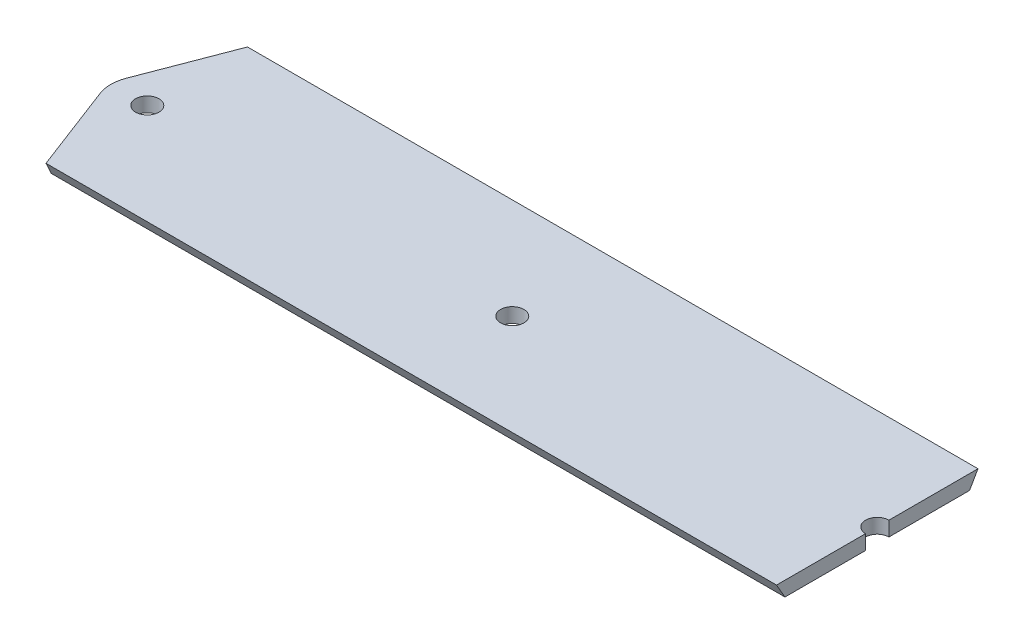
ISO-10303-21;
HEADER;
FILE_DESCRIPTION(('STEP AP214'),'2;1');
FILE_NAME('part.step','',(''),(''),'','','');
FILE_SCHEMA(('AUTOMOTIVE_DESIGN { 1 0 10303 214 1 1 1 1 }'));
ENDSEC;
DATA;
#1=APPLICATION_CONTEXT('core data for automotive mechanical design processes');
#2=APPLICATION_PROTOCOL_DEFINITION('international standard','automotive_design',2000,#1);
#3=PRODUCT_CONTEXT('',#1,'mechanical');
#4=PRODUCT('Part','Part','',(#3));
#5=PRODUCT_RELATED_PRODUCT_CATEGORY('part','',(#4));
#6=PRODUCT_DEFINITION_FORMATION('','',#4);
#7=PRODUCT_DEFINITION_CONTEXT('part definition',#1,'design');
#8=PRODUCT_DEFINITION('design','',#6,#7);
#9=PRODUCT_DEFINITION_SHAPE('','',#8);
#10=(LENGTH_UNIT() NAMED_UNIT(*) SI_UNIT(.MILLI.,.METRE.));
#11=(NAMED_UNIT(*) PLANE_ANGLE_UNIT() SI_UNIT($,.RADIAN.));
#12=(NAMED_UNIT(*) SI_UNIT($,.STERADIAN.) SOLID_ANGLE_UNIT());
#13=UNCERTAINTY_MEASURE_WITH_UNIT(LENGTH_MEASURE(1.E-05),#10,'distance_accuracy_value','');
#14=(GEOMETRIC_REPRESENTATION_CONTEXT(3) GLOBAL_UNCERTAINTY_ASSIGNED_CONTEXT((#13)) GLOBAL_UNIT_ASSIGNED_CONTEXT((#10,
#11,#12)) REPRESENTATION_CONTEXT('',''));
#15=CARTESIAN_POINT('',(0.,0.,0.));
#16=DIRECTION('',(0.,0.,1.));
#17=DIRECTION('',(1.,0.,0.));
#18=AXIS2_PLACEMENT_3D('',#15,#16,#17);
#19=CARTESIAN_POINT('',(50.,2.,0.));
#20=DIRECTION('',(-1.,0.,0.));
#21=DIRECTION('',(0.,0.,1.));
#22=AXIS2_PLACEMENT_3D('',#19,#20,#21);
#23=PLANE('',#22);
#24=DIRECTION('',(0.,0.,-1.));
#25=VECTOR('',#24,1.);
#26=CARTESIAN_POINT('',(50.,2.,0.));
#27=LINE('',#26,#25);
#28=CARTESIAN_POINT('',(50.,2.,13.8));
#29=VERTEX_POINT('',#28);
#30=CARTESIAN_POINT('',(50.,2.,1.6));
#31=VERTEX_POINT('',#30);
#32=EDGE_CURVE('E119',#29,#31,#27,.T.);
#33=ORIENTED_EDGE('',*,*,#32,.F.);
#34=DIRECTION('',(0.,-0.866025403784436,-0.500000000000004));
#35=VECTOR('',#34,1.);
#36=CARTESIAN_POINT('',(50.,0.,12.6452994616207));
#37=LINE('',#36,#35);
#38=CARTESIAN_POINT('',(50.,0.,12.6452994616207));
#39=VERTEX_POINT('',#38);
#40=EDGE_CURVE('E105',#29,#39,#37,.T.);
#41=ORIENTED_EDGE('',*,*,#40,.T.);
#42=DIRECTION('',(0.,0.,-1.));
#43=VECTOR('',#42,1.);
#44=CARTESIAN_POINT('',(50.,0.,0.));
#45=LINE('',#44,#43);
#46=CARTESIAN_POINT('',(50.,0.,1.6));
#47=VERTEX_POINT('',#46);
#48=EDGE_CURVE('E160',#39,#47,#45,.T.);
#49=ORIENTED_EDGE('',*,*,#48,.T.);
#50=DIRECTION('',(0.,-1.,0.));
#51=VECTOR('',#50,1.);
#52=CARTESIAN_POINT('',(50.,2.,1.6));
#53=LINE('',#52,#51);
#54=EDGE_CURVE('E11',#31,#47,#53,.T.);
#55=ORIENTED_EDGE('',*,*,#54,.F.);
#56=EDGE_LOOP('',(#33,#41,#49,#55));
#57=FACE_BOUND('',#56,.T.);
#58=ADVANCED_FACE('F41',(#57),#23,.F.);
#59=CARTESIAN_POINT('',(50.,2.,0.));
#60=DIRECTION('',(0.,-1.,0.));
#61=DIRECTION('',(0.,0.,-1.));
#62=AXIS2_PLACEMENT_3D('',#59,#60,#61);
#63=CYLINDRICAL_SURFACE('',#62,1.6);
#64=CARTESIAN_POINT('',(50.,0.,0.));
#65=DIRECTION('',(0.,1.,0.));
#66=DIRECTION('',(0.,0.,1.));
#67=AXIS2_PLACEMENT_3D('',#64,#65,#66);
#68=CIRCLE('',#67,1.6);
#69=CARTESIAN_POINT('',(50.,0.,-1.6));
#70=VERTEX_POINT('',#69);
#71=EDGE_CURVE('E163',#47,#70,#68,.F.);
#72=ORIENTED_EDGE('',*,*,#71,.T.);
#73=DIRECTION('',(0.,-1.,0.));
#74=VECTOR('',#73,1.);
#75=CARTESIAN_POINT('',(50.,2.,-1.6));
#76=LINE('',#75,#74);
#77=CARTESIAN_POINT('',(50.,2.,-1.6));
#78=VERTEX_POINT('',#77);
#79=EDGE_CURVE('E50',#78,#70,#76,.T.);
#80=ORIENTED_EDGE('',*,*,#79,.F.);
#81=CARTESIAN_POINT('',(50.,2.,0.));
#82=DIRECTION('',(0.,1.,0.));
#83=DIRECTION('',(0.,0.,1.));
#84=AXIS2_PLACEMENT_3D('',#81,#82,#83);
#85=CIRCLE('',#84,1.6);
#86=EDGE_CURVE('E127',#31,#78,#85,.F.);
#87=ORIENTED_EDGE('',*,*,#86,.F.);
#88=ORIENTED_EDGE('',*,*,#54,.T.);
#89=EDGE_LOOP('',(#72,#80,#87,#88));
#90=FACE_BOUND('',#89,.T.);
#91=ADVANCED_FACE('F237',(#90),#63,.F.);
#92=CARTESIAN_POINT('',(50.,2.,0.));
#93=DIRECTION('',(-1.,0.,0.));
#94=DIRECTION('',(0.,0.,1.));
#95=AXIS2_PLACEMENT_3D('',#92,#93,#94);
#96=PLANE('',#95);
#97=DIRECTION('',(0.,0.,-1.));
#98=VECTOR('',#97,1.);
#99=CARTESIAN_POINT('',(50.,0.,0.));
#100=LINE('',#99,#98);
#101=CARTESIAN_POINT('',(50.,0.,-12.6452994616207));
#102=VERTEX_POINT('',#101);
#103=EDGE_CURVE('E166',#70,#102,#100,.T.);
#104=ORIENTED_EDGE('',*,*,#103,.T.);
#105=DIRECTION('',(0.,0.866025403784436,-0.500000000000004));
#106=VECTOR('',#105,1.);
#107=CARTESIAN_POINT('',(50.,0.,-12.6452994616207));
#108=LINE('',#107,#106);
#109=CARTESIAN_POINT('',(50.,2.,-13.8));
#110=VERTEX_POINT('',#109);
#111=EDGE_CURVE('E65',#102,#110,#108,.T.);
#112=ORIENTED_EDGE('',*,*,#111,.T.);
#113=DIRECTION('',(0.,0.,-1.));
#114=VECTOR('',#113,1.);
#115=CARTESIAN_POINT('',(50.,2.,0.));
#116=LINE('',#115,#114);
#117=EDGE_CURVE('E132',#78,#110,#116,.T.);
#118=ORIENTED_EDGE('',*,*,#117,.F.);
#119=ORIENTED_EDGE('',*,*,#79,.T.);
#120=EDGE_LOOP('',(#104,#112,#118,#119));
#121=FACE_BOUND('',#120,.T.);
#122=ADVANCED_FACE('F192',(#121),#96,.F.);
#123=CARTESIAN_POINT('',(-48.2926978476711,2.,-18.4651745288546));
#124=DIRECTION('',(0.934049773615859,0.,0.357142857142856));
#125=DIRECTION('',(0.357142857142857,0.,-0.934049773615859));
#126=AXIS2_PLACEMENT_3D('',#123,#124,#125);
#127=PLANE('',#126);
#128=DIRECTION('',(-0.357142857142857,0.,0.934049773615859));
#129=VECTOR('',#128,1.);
#130=CARTESIAN_POINT('',(-48.2926978476711,2.,-18.4651745288546));
#131=LINE('',#130,#129);
#132=CARTESIAN_POINT('',(-50.0764719112902,2.,-13.8));
#133=VERTEX_POINT('',#132);
#134=CARTESIAN_POINT('',(-54.6702488680793,2.,-1.78571428571427));
#135=VERTEX_POINT('',#134);
#136=EDGE_CURVE('E142',#133,#135,#131,.T.);
#137=ORIENTED_EDGE('',*,*,#136,.F.);
#138=DIRECTION('',(-0.187778941547171,-0.850619951466907,0.491105657957491));
#139=VECTOR('',#138,1.);
#140=CARTESIAN_POINT('',(-49.5833552449018,4.23376951310278,-15.0896674296975));
#141=LINE('',#140,#139);
#142=CARTESIAN_POINT('',(-50.5179826969785,0.,-12.6452994616207));
#143=VERTEX_POINT('',#142);
#144=EDGE_CURVE('E156',#133,#143,#141,.T.);
#145=ORIENTED_EDGE('',*,*,#144,.T.);
#146=DIRECTION('',(-0.357142857142857,0.,0.934049773615859));
#147=VECTOR('',#146,1.);
#148=CARTESIAN_POINT('',(-48.2926978476711,0.,-18.4651745288546));
#149=LINE('',#148,#147);
#150=CARTESIAN_POINT('',(-54.6702488680793,0.,-1.78571428571427));
#151=VERTEX_POINT('',#150);
#152=EDGE_CURVE('E170',#143,#151,#149,.T.);
#153=ORIENTED_EDGE('',*,*,#152,.T.);
#154=DIRECTION('',(0.,-1.,0.));
#155=VECTOR('',#154,1.);
#156=CARTESIAN_POINT('',(-54.6702488680793,2.,-1.78571428571427));
#157=LINE('',#156,#155);
#158=EDGE_CURVE('E183',#135,#151,#157,.T.);
#159=ORIENTED_EDGE('',*,*,#158,.F.);
#160=EDGE_LOOP('',(#137,#145,#153,#159));
#161=FACE_BOUND('',#160,.T.);
#162=ADVANCED_FACE('F246',(#161),#127,.F.);
#163=CARTESIAN_POINT('',(-50.,2.,0.));
#164=DIRECTION('',(0.,-1.,0.));
#165=DIRECTION('',(0.,0.,-1.));
#166=AXIS2_PLACEMENT_3D('',#163,#164,#165);
#167=CYLINDRICAL_SURFACE('',#166,4.99999999999999);
#168=CARTESIAN_POINT('',(-50.,0.,0.));
#169=DIRECTION('',(0.,1.,0.));
#170=DIRECTION('',(0.,0.,1.));
#171=AXIS2_PLACEMENT_3D('',#168,#169,#170);
#172=CIRCLE('',#171,4.99999999999999);
#173=CARTESIAN_POINT('',(-54.6702488680793,0.,1.78571428571429));
#174=VERTEX_POINT('',#173);
#175=EDGE_CURVE('E173',#151,#174,#172,.T.);
#176=ORIENTED_EDGE('',*,*,#175,.T.);
#177=DIRECTION('',(0.,-1.,0.));
#178=VECTOR('',#177,1.);
#179=CARTESIAN_POINT('',(-54.6702488680793,2.,1.78571428571429));
#180=LINE('',#179,#178);
#181=CARTESIAN_POINT('',(-54.6702488680793,2.,1.78571428571429));
#182=VERTEX_POINT('',#181);
#183=EDGE_CURVE('E150',#182,#174,#180,.T.);
#184=ORIENTED_EDGE('',*,*,#183,.F.);
#185=CARTESIAN_POINT('',(-50.,2.,0.));
#186=DIRECTION('',(0.,1.,0.));
#187=DIRECTION('',(0.,0.,1.));
#188=AXIS2_PLACEMENT_3D('',#185,#186,#187);
#189=CIRCLE('',#188,4.99999999999999);
#190=EDGE_CURVE('E145',#135,#182,#189,.T.);
#191=ORIENTED_EDGE('',*,*,#190,.F.);
#192=ORIENTED_EDGE('',*,*,#158,.T.);
#193=EDGE_LOOP('',(#176,#184,#191,#192));
#194=FACE_BOUND('',#193,.T.);
#195=ADVANCED_FACE('F249',(#194),#167,.T.);
#196=CARTESIAN_POINT('',(-48.2926978476711,2.,18.4651745288546));
#197=DIRECTION('',(0.934049773615859,0.,-0.357142857142857));
#198=DIRECTION('',(-0.357142857142857,0.,-0.934049773615859));
#199=AXIS2_PLACEMENT_3D('',#196,#197,#198);
#200=PLANE('',#199);
#201=DIRECTION('',(0.357142857142857,0.,0.934049773615859));
#202=VECTOR('',#201,1.);
#203=CARTESIAN_POINT('',(-48.2926978476711,0.,18.4651745288546));
#204=LINE('',#203,#202);
#205=CARTESIAN_POINT('',(-50.5179826969785,0.,12.6452994616207));
#206=VERTEX_POINT('',#205);
#207=EDGE_CURVE('E176',#174,#206,#204,.T.);
#208=ORIENTED_EDGE('',*,*,#207,.T.);
#209=DIRECTION('',(0.187778941547171,0.850619951466907,0.491105657957491));
#210=VECTOR('',#209,1.);
#211=CARTESIAN_POINT('',(-49.5833552449018,4.23376951310278,15.0896674296975));
#212=LINE('',#211,#210);
#213=CARTESIAN_POINT('',(-50.0764719112902,2.,13.8));
#214=VERTEX_POINT('',#213);
#215=EDGE_CURVE('E57',#206,#214,#212,.T.);
#216=ORIENTED_EDGE('',*,*,#215,.T.);
#217=DIRECTION('',(0.357142857142857,0.,0.934049773615859));
#218=VECTOR('',#217,1.);
#219=CARTESIAN_POINT('',(-48.2926978476711,2.,18.4651745288546));
#220=LINE('',#219,#218);
#221=EDGE_CURVE('E122',#182,#214,#220,.T.);
#222=ORIENTED_EDGE('',*,*,#221,.F.);
#223=ORIENTED_EDGE('',*,*,#183,.T.);
#224=EDGE_LOOP('',(#208,#216,#222,#223));
#225=FACE_BOUND('',#224,.T.);
#226=ADVANCED_FACE('F224',(#225),#200,.F.);
#227=CARTESIAN_POINT('',(0.,2.,0.));
#228=DIRECTION('',(0.,-1.,0.));
#229=DIRECTION('',(0.,0.,-1.));
#230=AXIS2_PLACEMENT_3D('',#227,#228,#229);
#231=CYLINDRICAL_SURFACE('',#230,1.6);
#232=CARTESIAN_POINT('',(0.,2.,0.));
#233=DIRECTION('',(0.,1.,0.));
#234=DIRECTION('',(0.,0.,1.));
#235=AXIS2_PLACEMENT_3D('',#232,#233,#234);
#236=CIRCLE('',#235,1.6);
#237=CARTESIAN_POINT('',(0.,2.,1.6));
#238=VERTEX_POINT('',#237);
#239=EDGE_CURVE('E128',#238,#238,#236,.T.);
#240=ORIENTED_EDGE('',*,*,#239,.T.);
#241=EDGE_LOOP('',(#240));
#242=FACE_BOUND('',#241,.T.);
#243=CARTESIAN_POINT('',(0.,0.,0.));
#244=DIRECTION('',(0.,1.,0.));
#245=DIRECTION('',(0.,0.,1.));
#246=AXIS2_PLACEMENT_3D('',#243,#244,#245);
#247=CIRCLE('',#246,1.6);
#248=CARTESIAN_POINT('',(0.,0.,1.6));
#249=VERTEX_POINT('',#248);
#250=EDGE_CURVE('E155',#249,#249,#247,.T.);
#251=ORIENTED_EDGE('',*,*,#250,.F.);
#252=EDGE_LOOP('',(#251));
#253=FACE_BOUND('',#252,.T.);
#254=ADVANCED_FACE('F221',(#242,#253),#231,.F.);
#255=CARTESIAN_POINT('',(-50.,2.,0.));
#256=DIRECTION('',(0.,-1.,0.));
#257=DIRECTION('',(0.,0.,-1.));
#258=AXIS2_PLACEMENT_3D('',#255,#256,#257);
#259=CYLINDRICAL_SURFACE('',#258,1.6);
#260=CARTESIAN_POINT('',(-50.,2.,0.));
#261=DIRECTION('',(0.,1.,0.));
#262=DIRECTION('',(0.,0.,1.));
#263=AXIS2_PLACEMENT_3D('',#260,#261,#262);
#264=CIRCLE('',#263,1.6);
#265=CARTESIAN_POINT('',(-50.,2.,1.60000000000001));
#266=VERTEX_POINT('',#265);
#267=EDGE_CURVE('E135',#266,#266,#264,.T.);
#268=ORIENTED_EDGE('',*,*,#267,.T.);
#269=EDGE_LOOP('',(#268));
#270=FACE_BOUND('',#269,.T.);
#271=CARTESIAN_POINT('',(-50.,0.,0.));
#272=DIRECTION('',(0.,1.,0.));
#273=DIRECTION('',(0.,0.,1.));
#274=AXIS2_PLACEMENT_3D('',#271,#272,#273);
#275=CIRCLE('',#274,1.6);
#276=CARTESIAN_POINT('',(-50.,0.,1.60000000000001));
#277=VERTEX_POINT('',#276);
#278=EDGE_CURVE('E151',#277,#277,#275,.T.);
#279=ORIENTED_EDGE('',*,*,#278,.F.);
#280=EDGE_LOOP('',(#279));
#281=FACE_BOUND('',#280,.T.);
#282=ADVANCED_FACE('F43',(#270,#281),#259,.F.);
#283=CARTESIAN_POINT('',(0.,2.,0.));
#284=DIRECTION('',(0.,1.,0.));
#285=DIRECTION('',(0.,0.,1.));
#286=AXIS2_PLACEMENT_3D('',#283,#284,#285);
#287=PLANE('',#286);
#288=DIRECTION('',(-1.,0.,0.));
#289=VECTOR('',#288,1.);
#290=CARTESIAN_POINT('',(50.,2.,13.8));
#291=LINE('',#290,#289);
#292=EDGE_CURVE('E108',#29,#214,#291,.T.);
#293=ORIENTED_EDGE('',*,*,#292,.F.);
#294=ORIENTED_EDGE('',*,*,#32,.T.);
#295=ORIENTED_EDGE('',*,*,#86,.T.);
#296=ORIENTED_EDGE('',*,*,#117,.T.);
#297=DIRECTION('',(-1.,0.,0.));
#298=VECTOR('',#297,1.);
#299=CARTESIAN_POINT('',(50.,2.,-13.8));
#300=LINE('',#299,#298);
#301=EDGE_CURVE('E202',#110,#133,#300,.T.);
#302=ORIENTED_EDGE('',*,*,#301,.T.);
#303=ORIENTED_EDGE('',*,*,#136,.T.);
#304=ORIENTED_EDGE('',*,*,#190,.T.);
#305=ORIENTED_EDGE('',*,*,#221,.T.);
#306=EDGE_LOOP('',(#293,#294,#295,#296,#302,#303,#304,#305));
#307=FACE_BOUND('',#306,.T.);
#308=ORIENTED_EDGE('',*,*,#267,.F.);
#309=EDGE_LOOP('',(#308));
#310=FACE_BOUND('',#309,.T.);
#311=ORIENTED_EDGE('',*,*,#239,.F.);
#312=EDGE_LOOP('',(#311));
#313=FACE_BOUND('',#312,.T.);
#314=ADVANCED_FACE('F117',(#307,#310,#313),#287,.T.);
#315=CARTESIAN_POINT('',(0.,0.,0.));
#316=DIRECTION('',(0.,1.,0.));
#317=DIRECTION('',(0.,0.,1.));
#318=AXIS2_PLACEMENT_3D('',#315,#316,#317);
#319=PLANE('',#318);
#320=ORIENTED_EDGE('',*,*,#278,.T.);
#321=EDGE_LOOP('',(#320));
#322=FACE_BOUND('',#321,.T.);
#323=ORIENTED_EDGE('',*,*,#250,.T.);
#324=EDGE_LOOP('',(#323));
#325=FACE_BOUND('',#324,.T.);
#326=ORIENTED_EDGE('',*,*,#48,.F.);
#327=DIRECTION('',(-1.,0.,0.));
#328=VECTOR('',#327,1.);
#329=CARTESIAN_POINT('',(50.,0.,12.6452994616207));
#330=LINE('',#329,#328);
#331=EDGE_CURVE('E109',#39,#206,#330,.T.);
#332=ORIENTED_EDGE('',*,*,#331,.T.);
#333=ORIENTED_EDGE('',*,*,#207,.F.);
#334=ORIENTED_EDGE('',*,*,#175,.F.);
#335=ORIENTED_EDGE('',*,*,#152,.F.);
#336=DIRECTION('',(-1.,0.,0.));
#337=VECTOR('',#336,1.);
#338=CARTESIAN_POINT('',(50.,0.,-12.6452994616207));
#339=LINE('',#338,#337);
#340=EDGE_CURVE('E198',#102,#143,#339,.T.);
#341=ORIENTED_EDGE('',*,*,#340,.F.);
#342=ORIENTED_EDGE('',*,*,#103,.F.);
#343=ORIENTED_EDGE('',*,*,#71,.F.);
#344=EDGE_LOOP('',(#326,#332,#333,#334,#335,#341,#342,#343));
#345=FACE_BOUND('',#344,.T.);
#346=ADVANCED_FACE('F196',(#322,#325,#345),#319,.F.);
#347=CARTESIAN_POINT('',(50.,0.,-12.6452994616207));
#348=DIRECTION('',(0.,0.500000000000004,0.866025403784436));
#349=DIRECTION('',(0.,-0.866025403784436,0.500000000000004));
#350=AXIS2_PLACEMENT_3D('',#347,#348,#349);
#351=PLANE('',#350);
#352=ORIENTED_EDGE('',*,*,#301,.F.);
#353=ORIENTED_EDGE('',*,*,#111,.F.);
#354=ORIENTED_EDGE('',*,*,#340,.T.);
#355=ORIENTED_EDGE('',*,*,#144,.F.);
#356=EDGE_LOOP('',(#352,#353,#354,#355));
#357=FACE_BOUND('',#356,.T.);
#358=ADVANCED_FACE('F228',(#357),#351,.F.);
#359=CARTESIAN_POINT('',(50.,0.,12.6452994616207));
#360=DIRECTION('',(0.,0.500000000000004,-0.866025403784436));
#361=DIRECTION('',(0.,0.866025403784436,0.500000000000004));
#362=AXIS2_PLACEMENT_3D('',#359,#360,#361);
#363=PLANE('',#362);
#364=ORIENTED_EDGE('',*,*,#331,.F.);
#365=ORIENTED_EDGE('',*,*,#40,.F.);
#366=ORIENTED_EDGE('',*,*,#292,.T.);
#367=ORIENTED_EDGE('',*,*,#215,.F.);
#368=EDGE_LOOP('',(#364,#365,#366,#367));
#369=FACE_BOUND('',#368,.T.);
#370=ADVANCED_FACE('F107',(#369),#363,.F.);
#371=CLOSED_SHELL('',(#58,#91,#122,#162,#195,#226,#254,#282,#314,#346,#358,#370));
#372=MANIFOLD_SOLID_BREP('B2',#371);
#373=ADVANCED_BREP_SHAPE_REPRESENTATION('',(#18,#372),#14);
#374=SHAPE_DEFINITION_REPRESENTATION(#9,#373);
ENDSEC;
END-ISO-10303-21;
